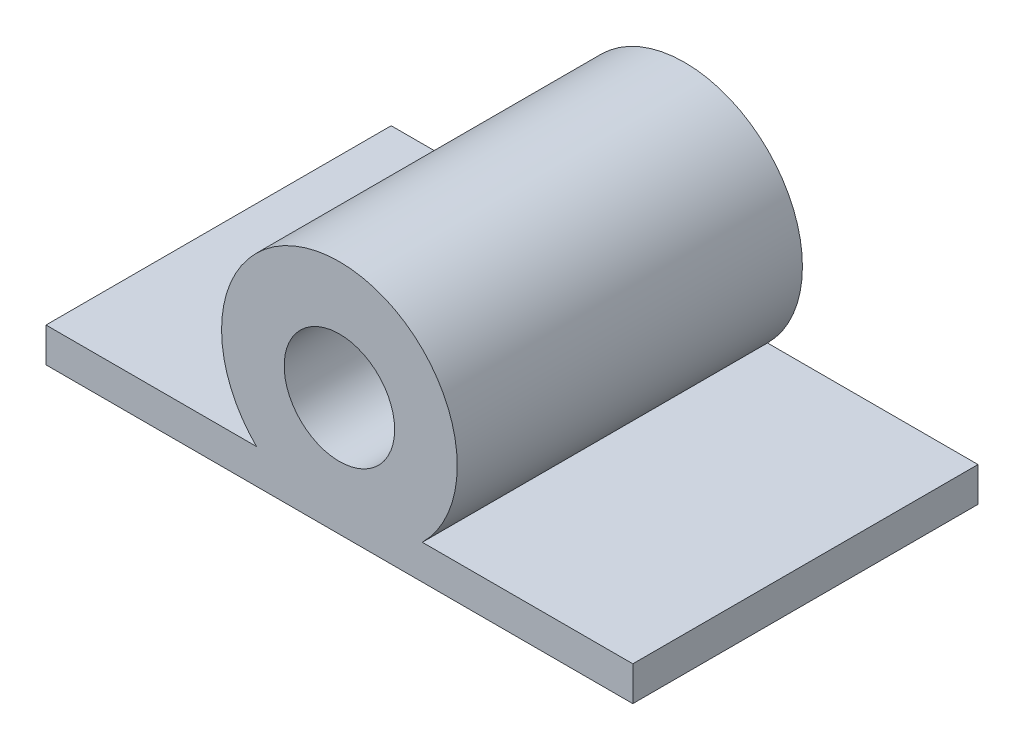
ISO-10303-21;
HEADER;
FILE_DESCRIPTION(('STEP AP214'),'2;1');
FILE_NAME('part.step','',(''),(''),'','','');
FILE_SCHEMA(('AUTOMOTIVE_DESIGN { 1 0 10303 214 1 1 1 1 }'));
ENDSEC;
DATA;
#1=APPLICATION_CONTEXT('core data for automotive mechanical design processes');
#2=APPLICATION_PROTOCOL_DEFINITION('international standard','automotive_design',2000,#1);
#3=PRODUCT_CONTEXT('',#1,'mechanical');
#4=PRODUCT('Part','Part','',(#3));
#5=PRODUCT_RELATED_PRODUCT_CATEGORY('part','',(#4));
#6=PRODUCT_DEFINITION_FORMATION('','',#4);
#7=PRODUCT_DEFINITION_CONTEXT('part definition',#1,'design');
#8=PRODUCT_DEFINITION('design','',#6,#7);
#9=PRODUCT_DEFINITION_SHAPE('','',#8);
#10=(LENGTH_UNIT() NAMED_UNIT(*) SI_UNIT(.MILLI.,.METRE.));
#11=(NAMED_UNIT(*) PLANE_ANGLE_UNIT() SI_UNIT($,.RADIAN.));
#12=(NAMED_UNIT(*) SI_UNIT($,.STERADIAN.) SOLID_ANGLE_UNIT());
#13=UNCERTAINTY_MEASURE_WITH_UNIT(LENGTH_MEASURE(1.E-05),#10,'distance_accuracy_value','');
#14=(GEOMETRIC_REPRESENTATION_CONTEXT(3) GLOBAL_UNCERTAINTY_ASSIGNED_CONTEXT((#13)) GLOBAL_UNIT_ASSIGNED_CONTEXT((#10,
#11,#12)) REPRESENTATION_CONTEXT('',''));
#15=CARTESIAN_POINT('',(0.,0.,0.));
#16=DIRECTION('',(0.,0.,1.));
#17=DIRECTION('',(1.,0.,0.));
#18=AXIS2_PLACEMENT_3D('',#15,#16,#17);
#19=CARTESIAN_POINT('',(0.,5.,0.));
#20=DIRECTION('',(0.,-1.,0.));
#21=DIRECTION('',(0.,0.,-1.));
#22=AXIS2_PLACEMENT_3D('',#19,#20,#21);
#23=PLANE('',#22);
#24=DIRECTION('',(-1.,0.,0.));
#25=VECTOR('',#24,1.);
#26=CARTESIAN_POINT('',(0.,5.,-50.));
#27=LINE('',#26,#25);
#28=CARTESIAN_POINT('',(85.,5.,-50.));
#29=VERTEX_POINT('',#28);
#30=CARTESIAN_POINT('',(54.5070895504334,5.,-50.));
#31=VERTEX_POINT('',#30);
#32=EDGE_CURVE('E66',#29,#31,#27,.T.);
#33=ORIENTED_EDGE('',*,*,#32,.T.);
#34=DIRECTION('',(0.,0.,1.));
#35=VECTOR('',#34,1.);
#36=CARTESIAN_POINT('',(54.5070895504334,5.,-50.));
#37=LINE('',#36,#35);
#38=CARTESIAN_POINT('',(54.5070895504334,5.,0.));
#39=VERTEX_POINT('',#38);
#40=EDGE_CURVE('E11',#31,#39,#37,.T.);
#41=ORIENTED_EDGE('',*,*,#40,.T.);
#42=DIRECTION('',(1.,0.,0.));
#43=VECTOR('',#42,1.);
#44=CARTESIAN_POINT('',(0.,5.,0.));
#45=LINE('',#44,#43);
#46=CARTESIAN_POINT('',(85.,5.,0.));
#47=VERTEX_POINT('',#46);
#48=EDGE_CURVE('E97',#39,#47,#45,.T.);
#49=ORIENTED_EDGE('',*,*,#48,.T.);
#50=DIRECTION('',(0.,0.,-1.));
#51=VECTOR('',#50,1.);
#52=CARTESIAN_POINT('',(85.,5.,0.));
#53=LINE('',#52,#51);
#54=EDGE_CURVE('E131',#47,#29,#53,.T.);
#55=ORIENTED_EDGE('',*,*,#54,.T.);
#56=EDGE_LOOP('',(#33,#41,#49,#55));
#57=FACE_BOUND('',#56,.T.);
#58=ADVANCED_FACE('F43',(#57),#23,.F.);
#59=CARTESIAN_POINT('',(0.,5.,0.));
#60=DIRECTION('',(1.,0.,0.));
#61=DIRECTION('',(0.,0.,-1.));
#62=AXIS2_PLACEMENT_3D('',#59,#60,#61);
#63=PLANE('',#62);
#64=DIRECTION('',(0.,0.,1.));
#65=VECTOR('',#64,1.);
#66=CARTESIAN_POINT('',(0.,0.,0.));
#67=LINE('',#66,#65);
#68=CARTESIAN_POINT('',(0.,0.,-50.));
#69=VERTEX_POINT('',#68);
#70=CARTESIAN_POINT('',(0.,0.,0.));
#71=VERTEX_POINT('',#70);
#72=EDGE_CURVE('E119',#69,#71,#67,.T.);
#73=ORIENTED_EDGE('',*,*,#72,.T.);
#74=DIRECTION('',(0.,-1.,0.));
#75=VECTOR('',#74,1.);
#76=CARTESIAN_POINT('',(0.,5.,0.));
#77=LINE('',#76,#75);
#78=CARTESIAN_POINT('',(0.,5.,0.));
#79=VERTEX_POINT('',#78);
#80=EDGE_CURVE('E158',#79,#71,#77,.T.);
#81=ORIENTED_EDGE('',*,*,#80,.F.);
#82=DIRECTION('',(0.,0.,1.));
#83=VECTOR('',#82,1.);
#84=CARTESIAN_POINT('',(0.,5.,0.));
#85=LINE('',#84,#83);
#86=CARTESIAN_POINT('',(0.,5.,-50.));
#87=VERTEX_POINT('',#86);
#88=EDGE_CURVE('E107',#87,#79,#85,.T.);
#89=ORIENTED_EDGE('',*,*,#88,.F.);
#90=DIRECTION('',(0.,-1.,0.));
#91=VECTOR('',#90,1.);
#92=CARTESIAN_POINT('',(0.,5.,-50.));
#93=LINE('',#92,#91);
#94=EDGE_CURVE('E137',#87,#69,#93,.T.);
#95=ORIENTED_EDGE('',*,*,#94,.T.);
#96=EDGE_LOOP('',(#73,#81,#89,#95));
#97=FACE_BOUND('',#96,.T.);
#98=ADVANCED_FACE('F45',(#97),#63,.F.);
#99=CARTESIAN_POINT('',(0.,5.,0.));
#100=DIRECTION('',(0.,0.,-1.));
#101=DIRECTION('',(-1.,0.,0.));
#102=AXIS2_PLACEMENT_3D('',#99,#100,#101);
#103=PLANE('',#102);
#104=ORIENTED_EDGE('',*,*,#48,.F.);
#105=CARTESIAN_POINT('',(42.5,17.1315708265429,0.));
#106=DIRECTION('',(0.,0.,1.));
#107=DIRECTION('',(1.,0.,0.));
#108=AXIS2_PLACEMENT_3D('',#105,#106,#107);
#109=CIRCLE('',#108,17.0688374001147);
#110=CARTESIAN_POINT('',(30.4929104495666,5.,0.));
#111=VERTEX_POINT('',#110);
#112=EDGE_CURVE('E101',#39,#111,#109,.T.);
#113=ORIENTED_EDGE('',*,*,#112,.T.);
#114=EDGE_CURVE('E106',#79,#111,#45,.T.);
#115=ORIENTED_EDGE('',*,*,#114,.F.);
#116=ORIENTED_EDGE('',*,*,#80,.T.);
#117=DIRECTION('',(1.,0.,0.));
#118=VECTOR('',#117,1.);
#119=CARTESIAN_POINT('',(0.,0.,0.));
#120=LINE('',#119,#118);
#121=CARTESIAN_POINT('',(85.,0.,0.));
#122=VERTEX_POINT('',#121);
#123=EDGE_CURVE('E141',#71,#122,#120,.T.);
#124=ORIENTED_EDGE('',*,*,#123,.T.);
#125=DIRECTION('',(0.,-1.,0.));
#126=VECTOR('',#125,1.);
#127=CARTESIAN_POINT('',(85.,5.,0.));
#128=LINE('',#127,#126);
#129=EDGE_CURVE('E103',#47,#122,#128,.T.);
#130=ORIENTED_EDGE('',*,*,#129,.F.);
#131=EDGE_LOOP('',(#104,#113,#115,#116,#124,#130));
#132=FACE_BOUND('',#131,.T.);
#133=CARTESIAN_POINT('',(42.5,17.1315708265429,0.));
#134=DIRECTION('',(0.,0.,1.));
#135=DIRECTION('',(1.,0.,0.));
#136=AXIS2_PLACEMENT_3D('',#133,#134,#135);
#137=CIRCLE('',#136,8.);
#138=CARTESIAN_POINT('',(50.5,17.1315708265429,0.));
#139=VERTEX_POINT('',#138);
#140=EDGE_CURVE('E122',#139,#139,#137,.T.);
#141=ORIENTED_EDGE('',*,*,#140,.F.);
#142=EDGE_LOOP('',(#141));
#143=FACE_BOUND('',#142,.T.);
#144=ADVANCED_FACE('F98',(#132,#143),#103,.F.);
#145=CARTESIAN_POINT('',(85.,5.,0.));
#146=DIRECTION('',(-1.,0.,0.));
#147=DIRECTION('',(0.,0.,1.));
#148=AXIS2_PLACEMENT_3D('',#145,#146,#147);
#149=PLANE('',#148);
#150=DIRECTION('',(0.,0.,-1.));
#151=VECTOR('',#150,1.);
#152=CARTESIAN_POINT('',(85.,0.,0.));
#153=LINE('',#152,#151);
#154=CARTESIAN_POINT('',(85.,0.,-50.));
#155=VERTEX_POINT('',#154);
#156=EDGE_CURVE('E144',#122,#155,#153,.T.);
#157=ORIENTED_EDGE('',*,*,#156,.T.);
#158=DIRECTION('',(0.,-1.,0.));
#159=VECTOR('',#158,1.);
#160=CARTESIAN_POINT('',(85.,5.,-50.));
#161=LINE('',#160,#159);
#162=EDGE_CURVE('E152',#29,#155,#161,.T.);
#163=ORIENTED_EDGE('',*,*,#162,.F.);
#164=ORIENTED_EDGE('',*,*,#54,.F.);
#165=ORIENTED_EDGE('',*,*,#129,.T.);
#166=EDGE_LOOP('',(#157,#163,#164,#165));
#167=FACE_BOUND('',#166,.T.);
#168=ADVANCED_FACE('F177',(#167),#149,.F.);
#169=CARTESIAN_POINT('',(0.,5.,-50.));
#170=DIRECTION('',(0.,0.,1.));
#171=DIRECTION('',(1.,0.,0.));
#172=AXIS2_PLACEMENT_3D('',#169,#170,#171);
#173=PLANE('',#172);
#174=CARTESIAN_POINT('',(30.4929104495666,5.,-50.));
#175=VERTEX_POINT('',#174);
#176=EDGE_CURVE('E134',#175,#87,#27,.T.);
#177=ORIENTED_EDGE('',*,*,#176,.F.);
#178=CARTESIAN_POINT('',(42.5,17.1315708265429,-50.));
#179=DIRECTION('',(0.,0.,1.));
#180=DIRECTION('',(1.,0.,0.));
#181=AXIS2_PLACEMENT_3D('',#178,#179,#180);
#182=CIRCLE('',#181,17.0688374001147);
#183=EDGE_CURVE('E114',#31,#175,#182,.T.);
#184=ORIENTED_EDGE('',*,*,#183,.F.);
#185=ORIENTED_EDGE('',*,*,#32,.F.);
#186=ORIENTED_EDGE('',*,*,#162,.T.);
#187=DIRECTION('',(-1.,0.,0.));
#188=VECTOR('',#187,1.);
#189=CARTESIAN_POINT('',(0.,0.,-50.));
#190=LINE('',#189,#188);
#191=EDGE_CURVE('E128',#155,#69,#190,.T.);
#192=ORIENTED_EDGE('',*,*,#191,.T.);
#193=ORIENTED_EDGE('',*,*,#94,.F.);
#194=EDGE_LOOP('',(#177,#184,#185,#186,#192,#193));
#195=FACE_BOUND('',#194,.T.);
#196=CARTESIAN_POINT('',(42.5,17.1315708265429,-50.));
#197=DIRECTION('',(0.,0.,1.));
#198=DIRECTION('',(1.,0.,0.));
#199=AXIS2_PLACEMENT_3D('',#196,#197,#198);
#200=CIRCLE('',#199,8.);
#201=CARTESIAN_POINT('',(50.5,17.1315708265429,-50.));
#202=VERTEX_POINT('',#201);
#203=EDGE_CURVE('E115',#202,#202,#200,.T.);
#204=ORIENTED_EDGE('',*,*,#203,.T.);
#205=EDGE_LOOP('',(#204));
#206=FACE_BOUND('',#205,.T.);
#207=ADVANCED_FACE('F169',(#195,#206),#173,.F.);
#208=CARTESIAN_POINT('',(11.6652904616334,5.,-36.1704051226168));
#209=DIRECTION('',(0.,1.,0.));
#210=DIRECTION('',(0.,0.,1.));
#211=AXIS2_PLACEMENT_3D('',#208,#209,#210);
#212=CIRCLE('',#211,1.5);
#213=CARTESIAN_POINT('',(11.6652904616334,5.,-34.6704051226168));
#214=VERTEX_POINT('',#213);
#215=EDGE_CURVE('E210',#214,#214,#212,.T.);
#216=ORIENTED_EDGE('',*,*,#215,.F.);
#217=EDGE_LOOP('',(#216));
#218=FACE_BOUND('',#217,.T.);
#219=ORIENTED_EDGE('',*,*,#114,.T.);
#220=DIRECTION('',(0.,0.,1.));
#221=VECTOR('',#220,1.);
#222=CARTESIAN_POINT('',(30.4929104495666,5.,-50.));
#223=LINE('',#222,#221);
#224=EDGE_CURVE('E53',#111,#175,#223,.F.);
#225=ORIENTED_EDGE('',*,*,#224,.T.);
#226=ORIENTED_EDGE('',*,*,#176,.T.);
#227=ORIENTED_EDGE('',*,*,#88,.T.);
#228=EDGE_LOOP('',(#219,#225,#226,#227));
#229=FACE_BOUND('',#228,.T.);
#230=ADVANCED_FACE('F165',(#218,#229),#23,.F.);
#231=CARTESIAN_POINT('',(0.,0.,0.));
#232=DIRECTION('',(0.,-1.,0.));
#233=DIRECTION('',(0.,0.,-1.));
#234=AXIS2_PLACEMENT_3D('',#231,#232,#233);
#235=PLANE('',#234);
#236=CARTESIAN_POINT('',(11.6652904616334,0.,-36.1704051226168));
#237=DIRECTION('',(0.,-1.,0.));
#238=DIRECTION('',(0.,0.,-1.));
#239=AXIS2_PLACEMENT_3D('',#236,#237,#238);
#240=CIRCLE('',#239,1.5);
#241=CARTESIAN_POINT('',(11.6652904616334,0.,-37.6704051226168));
#242=VERTEX_POINT('',#241);
#243=EDGE_CURVE('E47',#242,#242,#240,.T.);
#244=ORIENTED_EDGE('',*,*,#243,.F.);
#245=EDGE_LOOP('',(#244));
#246=FACE_BOUND('',#245,.T.);
#247=ORIENTED_EDGE('',*,*,#72,.F.);
#248=ORIENTED_EDGE('',*,*,#191,.F.);
#249=ORIENTED_EDGE('',*,*,#156,.F.);
#250=ORIENTED_EDGE('',*,*,#123,.F.);
#251=EDGE_LOOP('',(#247,#248,#249,#250));
#252=FACE_BOUND('',#251,.T.);
#253=ADVANCED_FACE('F179',(#246,#252),#235,.T.);
#254=CARTESIAN_POINT('',(42.5,17.1315708265429,-50.));
#255=DIRECTION('',(0.,0.,1.));
#256=DIRECTION('',(1.,0.,0.));
#257=AXIS2_PLACEMENT_3D('',#254,#255,#256);
#258=CYLINDRICAL_SURFACE('',#257,17.0688374001147);
#259=ORIENTED_EDGE('',*,*,#40,.F.);
#260=ORIENTED_EDGE('',*,*,#183,.T.);
#261=ORIENTED_EDGE('',*,*,#224,.F.);
#262=ORIENTED_EDGE('',*,*,#112,.F.);
#263=EDGE_LOOP('',(#259,#260,#261,#262));
#264=FACE_BOUND('',#263,.T.);
#265=ADVANCED_FACE('F112',(#264),#258,.T.);
#266=CARTESIAN_POINT('',(42.5,17.1315708265429,-50.));
#267=DIRECTION('',(0.,0.,1.));
#268=DIRECTION('',(1.,0.,0.));
#269=AXIS2_PLACEMENT_3D('',#266,#267,#268);
#270=CYLINDRICAL_SURFACE('',#269,8.);
#271=ORIENTED_EDGE('',*,*,#203,.F.);
#272=EDGE_LOOP('',(#271));
#273=FACE_BOUND('',#272,.T.);
#274=ORIENTED_EDGE('',*,*,#140,.T.);
#275=EDGE_LOOP('',(#274));
#276=FACE_BOUND('',#275,.T.);
#277=ADVANCED_FACE('F187',(#273,#276),#270,.F.);
#278=CARTESIAN_POINT('',(11.6652904616334,-45.,-36.1704051226168));
#279=DIRECTION('',(0.,1.,0.));
#280=DIRECTION('',(0.,0.,1.));
#281=AXIS2_PLACEMENT_3D('',#278,#279,#280);
#282=CYLINDRICAL_SURFACE('',#281,1.5);
#283=ORIENTED_EDGE('',*,*,#243,.T.);
#284=EDGE_LOOP('',(#283));
#285=FACE_BOUND('',#284,.T.);
#286=ORIENTED_EDGE('',*,*,#215,.T.);
#287=EDGE_LOOP('',(#286));
#288=FACE_BOUND('',#287,.T.);
#289=ADVANCED_FACE('F200',(#285,#288),#282,.F.);
#290=CLOSED_SHELL('',(#58,#98,#144,#168,#207,#230,#253,#265,#277,#289));
#291=MANIFOLD_SOLID_BREP('B2',#290);
#292=ADVANCED_BREP_SHAPE_REPRESENTATION('',(#18,#291),#14);
#293=SHAPE_DEFINITION_REPRESENTATION(#9,#292);
ENDSEC;
END-ISO-10303-21;
